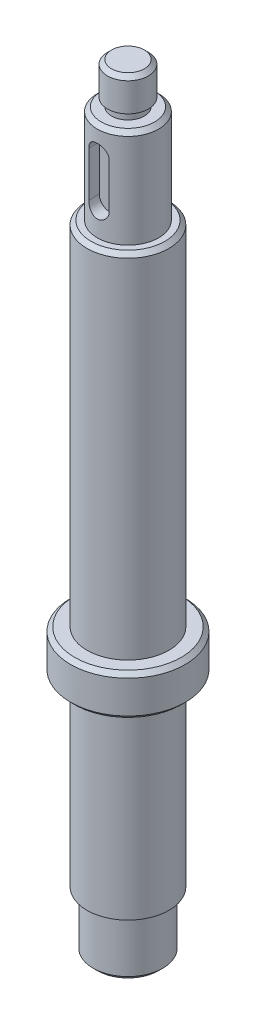
ISO-10303-21;
HEADER;
FILE_DESCRIPTION(('STEP AP214'),'2;1');
FILE_NAME('part.step','',(''),(''),'','','');
FILE_SCHEMA(('AUTOMOTIVE_DESIGN { 1 0 10303 214 1 1 1 1 }'));
ENDSEC;
DATA;
#1=APPLICATION_CONTEXT('core data for automotive mechanical design processes');
#2=APPLICATION_PROTOCOL_DEFINITION('international standard','automotive_design',2000,#1);
#3=PRODUCT_CONTEXT('',#1,'mechanical');
#4=PRODUCT('Part','Part','',(#3));
#5=PRODUCT_RELATED_PRODUCT_CATEGORY('part','',(#4));
#6=PRODUCT_DEFINITION_FORMATION('','',#4);
#7=PRODUCT_DEFINITION_CONTEXT('part definition',#1,'design');
#8=PRODUCT_DEFINITION('design','',#6,#7);
#9=PRODUCT_DEFINITION_SHAPE('','',#8);
#10=(LENGTH_UNIT() NAMED_UNIT(*) SI_UNIT(.MILLI.,.METRE.));
#11=(NAMED_UNIT(*) PLANE_ANGLE_UNIT() SI_UNIT($,.RADIAN.));
#12=(NAMED_UNIT(*) SI_UNIT($,.STERADIAN.) SOLID_ANGLE_UNIT());
#13=UNCERTAINTY_MEASURE_WITH_UNIT(LENGTH_MEASURE(1.E-05),#10,'distance_accuracy_value','');
#14=(GEOMETRIC_REPRESENTATION_CONTEXT(3) GLOBAL_UNCERTAINTY_ASSIGNED_CONTEXT((#13)) GLOBAL_UNIT_ASSIGNED_CONTEXT((#10,
#11,#12)) REPRESENTATION_CONTEXT('',''));
#15=CARTESIAN_POINT('',(0.,0.,0.));
#16=DIRECTION('',(0.,0.,1.));
#17=DIRECTION('',(1.,0.,0.));
#18=AXIS2_PLACEMENT_3D('',#15,#16,#17);
#19=CARTESIAN_POINT('',(0.,0.,0.));
#20=DIRECTION('',(0.,1.,0.));
#21=DIRECTION('',(0.,0.,1.));
#22=AXIS2_PLACEMENT_3D('',#19,#20,#21);
#23=CYLINDRICAL_SURFACE('',#22,9.99999999999998);
#24=CARTESIAN_POINT('',(0.,-175.,0.));
#25=DIRECTION('',(0.,1.,0.));
#26=DIRECTION('',(0.,0.,1.));
#27=AXIS2_PLACEMENT_3D('',#24,#25,#26);
#28=CIRCLE('',#27,9.99999999999998);
#29=CARTESIAN_POINT('',(0.,-175.,9.99999999999998));
#30=VERTEX_POINT('',#29);
#31=EDGE_CURVE('E175',#30,#30,#28,.T.);
#32=ORIENTED_EDGE('',*,*,#31,.T.);
#33=EDGE_LOOP('',(#32));
#34=FACE_BOUND('',#33,.T.);
#35=CARTESIAN_POINT('',(0.,-130.,0.));
#36=DIRECTION('',(0.,1.,0.));
#37=DIRECTION('',(0.,0.,1.));
#38=AXIS2_PLACEMENT_3D('',#35,#36,#37);
#39=CIRCLE('',#38,9.99999999999999);
#40=CARTESIAN_POINT('',(0.,-130.,9.99999999999999));
#41=VERTEX_POINT('',#40);
#42=EDGE_CURVE('E179',#41,#41,#39,.T.);
#43=ORIENTED_EDGE('',*,*,#42,.F.);
#44=EDGE_LOOP('',(#43));
#45=FACE_BOUND('',#44,.T.);
#46=DIRECTION('',(0.,1.,0.));
#47=VECTOR('',#46,1.);
#48=CARTESIAN_POINT('',(3.,0.,-9.53939201416944));
#49=LINE('',#48,#47);
#50=CARTESIAN_POINT('',(3.,-152.,-9.53939201416944));
#51=VERTEX_POINT('',#50);
#52=CARTESIAN_POINT('',(3.,-138.,-9.53939201416944));
#53=VERTEX_POINT('',#52);
#54=EDGE_CURVE('E11',#51,#53,#49,.T.);
#55=ORIENTED_EDGE('',*,*,#54,.T.);
#56=CARTESIAN_POINT('',(3.,-138.,-9.53939201416944));
#57=CARTESIAN_POINT('',(3.00001027845728,-137.917664479177,-9.53938054248205));
#58=CARTESIAN_POINT('',(2.99661062684472,-137.835335544937,-9.54045772064377));
#59=CARTESIAN_POINT('',(2.98307142899347,-137.671306047235,-9.54470412105984));
#60=CARTESIAN_POINT('',(2.97293339805419,-137.589605346676,-9.54787287296847));
#61=CARTESIAN_POINT('',(2.94603140625046,-137.427615084327,-9.55620668351001));
#62=CARTESIAN_POINT('',(2.92928426957737,-137.347322475957,-9.56136667250113));
#63=CARTESIAN_POINT('',(2.88932853030395,-137.188524155866,-9.57351626651177));
#64=CARTESIAN_POINT('',(2.86611975872641,-137.110018490933,-9.58050591937826));
#65=CARTESIAN_POINT('',(2.78708584446024,-136.87805061201,-9.60391637654135));
#66=CARTESIAN_POINT('',(2.72181852542972,-136.727931561167,-9.62279007830389));
#67=CARTESIAN_POINT('',(2.56815043531276,-136.440773956021,-9.66493213967818));
#68=CARTESIAN_POINT('',(2.4797388992416,-136.303741529238,-9.68820254290639));
#69=CARTESIAN_POINT('',(2.27929879634443,-136.042277012052,-9.73733650515373));
#70=CARTESIAN_POINT('',(2.16666914746584,-135.918315125939,-9.76325505469872));
#71=CARTESIAN_POINT('',(1.92227736150434,-135.690726385161,-9.81429628475076));
#72=CARTESIAN_POINT('',(1.79051199848164,-135.587102966139,-9.83941883019408));
#73=CARTESIAN_POINT('',(1.50821997465698,-135.401073134905,-9.88666477976533));
#74=CARTESIAN_POINT('',(1.35736167401016,-135.319149820217,-9.90871541546876));
#75=CARTESIAN_POINT('',(1.04324233568303,-135.182022995997,-9.94668940088142));
#76=CARTESIAN_POINT('',(0.879984508687989,-135.126812596632,-9.96261433032401));
#77=CARTESIAN_POINT('',(0.550649404820608,-135.046240448209,-9.98615279768396));
#78=CARTESIAN_POINT('',(0.384786253016209,-135.020070296482,-9.9939909852679));
#79=CARTESIAN_POINT('',(0.0508471415689364,-134.995765304854,-10.0012640407204));
#80=CARTESIAN_POINT('',(-0.117228393125328,-134.997625157322,-10.0007004995012));
#81=CARTESIAN_POINT('',(-0.445143199271813,-135.028785820691,-9.99139205125585));
#82=CARTESIAN_POINT('',(-0.605074290763018,-135.057210690808,-9.98290831016511));
#83=CARTESIAN_POINT('',(-0.917780104370304,-135.139263269625,-9.95903027401821));
#84=CARTESIAN_POINT('',(-1.07055445110878,-135.192892298683,-9.94363561692557));
#85=CARTESIAN_POINT('',(-1.3666956317391,-135.324424443525,-9.9073042985178));
#86=CARTESIAN_POINT('',(-1.50993201207611,-135.402603288776,-9.88630511384913));
#87=CARTESIAN_POINT('',(-1.78153105916099,-135.580797180034,-9.84099249303645));
#88=CARTESIAN_POINT('',(-1.90989038323249,-135.680817118941,-9.81667831471804));
#89=CARTESIAN_POINT('',(-2.15330901082204,-135.904383976185,-9.76623347142779));
#90=CARTESIAN_POINT('',(-2.26766702955975,-136.028687727526,-9.74006890899095));
#91=CARTESIAN_POINT('',(-2.47413538985067,-136.294994846851,-9.68968430229325));
#92=CARTESIAN_POINT('',(-2.5662392402618,-136.43700336073,-9.66546482675132));
#93=CARTESIAN_POINT('',(-2.72632814481702,-136.7365618569,-9.62154457591301));
#94=CARTESIAN_POINT('',(-2.79406012682263,-136.894254359187,-9.60189192491893));
#95=CARTESIAN_POINT('',(-2.90171772009405,-137.219449007963,-9.56991327306401));
#96=CARTESIAN_POINT('',(-2.94168586436072,-137.386935721429,-9.55757606951748));
#97=CARTESIAN_POINT('',(-2.97802407180158,-137.62998977814,-9.5462806465001));
#98=CARTESIAN_POINT('',(-2.98626405978017,-137.703781468359,-9.54370312550532));
#99=CARTESIAN_POINT('',(-2.99724711229708,-137.851702958199,-9.54025857223562));
#100=CARTESIAN_POINT('',(-2.99999825936538,-137.925832099328,-9.53938902493286));
#101=CARTESIAN_POINT('',(-3.,-138.,-9.53939201416944));
#102=B_SPLINE_CURVE_WITH_KNOTS('',3,(#56,#57,#58,#59,#60,#61,#62,#63,#64,#65,#66,#67,#68,#69,
#70,#71,#72,#73,#74,#75,#76,#77,#78,#79,#80,#81,#82,#83,#84,#85,#86,#87,#88,#89,#90,#91,#92,#93,
#94,#95,#96,#97,#98,#99,#100,#101),.UNSPECIFIED.,.F.,.F.,(4,2,2,2,2,2,2,2,2,2,2,2,2,2,2,2,2,2,2,
2,2,2,4),(0.,0.246918142439474,0.493780777706052,0.740019009623012,0.986263681482012,
1.47813347402026,1.97023245590778,2.47635119822767,2.98255536239032,3.4992281062007,
4.01576751791672,4.51753600864763,5.019209488041,5.50490358251091,5.9906231236083,
6.48200583350619,6.97349873739168,7.48389234847122,7.99443465298716,8.51013494368215,
9.02504345105572,9.24774267716777,9.47011372732391),.UNSPECIFIED.);
#103=CARTESIAN_POINT('',(-3.,-138.,-9.53939201416944));
#104=VERTEX_POINT('',#103);
#105=EDGE_CURVE('E295',#53,#104,#102,.T.);
#106=ORIENTED_EDGE('',*,*,#105,.T.);
#107=DIRECTION('',(0.,1.,0.));
#108=VECTOR('',#107,1.);
#109=CARTESIAN_POINT('',(-3.,0.,-9.53939201416944));
#110=LINE('',#109,#108);
#111=CARTESIAN_POINT('',(-3.,-152.,-9.53939201416944));
#112=VERTEX_POINT('',#111);
#113=EDGE_CURVE('E55',#104,#112,#110,.F.);
#114=ORIENTED_EDGE('',*,*,#113,.T.);
#115=CARTESIAN_POINT('',(-3.,-152.,-9.53939201416944));
#116=CARTESIAN_POINT('',(-3.00001027845728,-152.082335520823,-9.53938054248205));
#117=CARTESIAN_POINT('',(-2.99661062684472,-152.164664455063,-9.54045772064377));
#118=CARTESIAN_POINT('',(-2.98307142899347,-152.328693952765,-9.54470412105984));
#119=CARTESIAN_POINT('',(-2.97293339805418,-152.410394653324,-9.54787287296847));
#120=CARTESIAN_POINT('',(-2.94603140625045,-152.572384915673,-9.55620668351001));
#121=CARTESIAN_POINT('',(-2.92928426957737,-152.652677524043,-9.56136667250113));
#122=CARTESIAN_POINT('',(-2.88932853030395,-152.811475844134,-9.57351626651177));
#123=CARTESIAN_POINT('',(-2.86611975872641,-152.889981509067,-9.58050591937826));
#124=CARTESIAN_POINT('',(-2.78708584446024,-153.12194938799,-9.60391637654135));
#125=CARTESIAN_POINT('',(-2.72181852542972,-153.272068438833,-9.62279007830389));
#126=CARTESIAN_POINT('',(-2.56815043531276,-153.559226043979,-9.66493213967818));
#127=CARTESIAN_POINT('',(-2.4797388992416,-153.696258470762,-9.68820254290639));
#128=CARTESIAN_POINT('',(-2.27929879634443,-153.957722987948,-9.73733650515373));
#129=CARTESIAN_POINT('',(-2.16666914746584,-154.081684874061,-9.76325505469872));
#130=CARTESIAN_POINT('',(-1.92227736150434,-154.309273614839,-9.81429628475075));
#131=CARTESIAN_POINT('',(-1.79051199848164,-154.412897033861,-9.83941883019408));
#132=CARTESIAN_POINT('',(-1.50821997465698,-154.598926865095,-9.88666477976533));
#133=CARTESIAN_POINT('',(-1.35736167401016,-154.680850179783,-9.90871541546876));
#134=CARTESIAN_POINT('',(-1.04324233568303,-154.817977004003,-9.94668940088142));
#135=CARTESIAN_POINT('',(-0.879984508687989,-154.873187403368,-9.96261433032401));
#136=CARTESIAN_POINT('',(-0.550649404820608,-154.953759551791,-9.98615279768396));
#137=CARTESIAN_POINT('',(-0.384786253016209,-154.979929703518,-9.9939909852679));
#138=CARTESIAN_POINT('',(-0.0508471415689364,-155.004234695146,-10.0012640407204));
#139=CARTESIAN_POINT('',(0.117228393125328,-155.002374842678,-10.0007004995012));
#140=CARTESIAN_POINT('',(0.445143199271813,-154.971214179309,-9.99139205125585));
#141=CARTESIAN_POINT('',(0.605074290763018,-154.942789309192,-9.98290831016511));
#142=CARTESIAN_POINT('',(0.917780104370304,-154.860736730375,-9.95903027401821));
#143=CARTESIAN_POINT('',(1.07055445110878,-154.807107701317,-9.94363561692557));
#144=CARTESIAN_POINT('',(1.3666956317391,-154.675575556475,-9.9073042985178));
#145=CARTESIAN_POINT('',(1.50993201207611,-154.597396711224,-9.88630511384913));
#146=CARTESIAN_POINT('',(1.78153105916099,-154.419202819966,-9.84099249303645));
#147=CARTESIAN_POINT('',(1.90989038323249,-154.319182881059,-9.81667831471804));
#148=CARTESIAN_POINT('',(2.15330901082204,-154.095616023815,-9.76623347142779));
#149=CARTESIAN_POINT('',(2.26766702955975,-153.971312272474,-9.74006890899095));
#150=CARTESIAN_POINT('',(2.47413538985067,-153.705005153149,-9.68968430229325));
#151=CARTESIAN_POINT('',(2.5662392402618,-153.56299663927,-9.66546482675132));
#152=CARTESIAN_POINT('',(2.72632814481701,-153.2634381431,-9.62154457591302));
#153=CARTESIAN_POINT('',(2.79406012682262,-153.105745640813,-9.60189192491894));
#154=CARTESIAN_POINT('',(2.90171772009404,-152.780550992037,-9.56991327306401));
#155=CARTESIAN_POINT('',(2.94168586436072,-152.613064278571,-9.55757606951748));
#156=CARTESIAN_POINT('',(2.97802407180158,-152.37001022186,-9.5462806465001));
#157=CARTESIAN_POINT('',(2.98626405978017,-152.296218531641,-9.54370312550532));
#158=CARTESIAN_POINT('',(2.99724711229708,-152.148297041801,-9.54025857223563));
#159=CARTESIAN_POINT('',(2.99999825936538,-152.074167900672,-9.53938902493286));
#160=CARTESIAN_POINT('',(3.,-152.,-9.53939201416944));
#161=B_SPLINE_CURVE_WITH_KNOTS('',3,(#115,#116,#117,#118,#119,#120,#121,#122,#123,#124,#125,
#126,#127,#128,#129,#130,#131,#132,#133,#134,#135,#136,#137,#138,#139,#140,#141,#142,#143,#144,
#145,#146,#147,#148,#149,#150,#151,#152,#153,#154,#155,#156,#157,#158,#159,#160),.UNSPECIFIED.,
.F.,.F.,(4,2,2,2,2,2,2,2,2,2,2,2,2,2,2,2,2,2,2,2,2,2,4),(0.,0.246918142439474,0.49378077770608,
0.740019009623012,0.986263681482012,1.47813347402026,1.97023245590778,2.47635119822767,
2.98255536239032,3.4992281062007,4.01576751791672,4.51753600864763,5.019209488041,
5.50490358251091,5.9906231236083,6.48200583350619,6.97349873739168,7.48389234847122,
7.99443465298716,8.51013494368209,9.02504345105573,9.24774267716778,9.47011372732391),.UNSPECIFIED.);
#162=EDGE_CURVE('E62',#112,#51,#161,.T.);
#163=ORIENTED_EDGE('',*,*,#162,.T.);
#164=EDGE_LOOP('',(#55,#106,#114,#163));
#165=FACE_BOUND('',#164,.T.);
#166=ADVANCED_FACE('F45',(#34,#45,#165),#23,.T.);
#167=CARTESIAN_POINT('',(0.,0.,0.));
#168=DIRECTION('',(0.,1.,0.));
#169=DIRECTION('',(0.,0.,1.));
#170=AXIS2_PLACEMENT_3D('',#167,#168,#169);
#171=PLANE('',#170);
#172=CARTESIAN_POINT('',(0.,0.,0.));
#173=DIRECTION('',(0.,1.,0.));
#174=DIRECTION('',(0.,0.,1.));
#175=AXIS2_PLACEMENT_3D('',#172,#173,#174);
#176=CIRCLE('',#175,4.);
#177=CARTESIAN_POINT('',(0.,0.,4.));
#178=VERTEX_POINT('',#177);
#179=EDGE_CURVE('E243',#178,#178,#176,.T.);
#180=ORIENTED_EDGE('',*,*,#179,.T.);
#181=EDGE_LOOP('',(#180));
#182=FACE_BOUND('',#181,.T.);
#183=ADVANCED_FACE('F329',(#182),#171,.T.);
#184=CARTESIAN_POINT('',(0.,0.,0.));
#185=DIRECTION('',(0.,1.,0.));
#186=DIRECTION('',(0.,0.,1.));
#187=AXIS2_PLACEMENT_3D('',#184,#185,#186);
#188=CYLINDRICAL_SURFACE('',#187,5.);
#189=CARTESIAN_POINT('',(0.,-0.999999999999986,0.));
#190=DIRECTION('',(0.,1.,0.));
#191=DIRECTION('',(0.,0.,1.));
#192=AXIS2_PLACEMENT_3D('',#189,#190,#191);
#193=CIRCLE('',#192,5.);
#194=CARTESIAN_POINT('',(0.,-0.999999999999986,5.));
#195=VERTEX_POINT('',#194);
#196=EDGE_CURVE('E247',#195,#195,#193,.F.);
#197=ORIENTED_EDGE('',*,*,#196,.T.);
#198=EDGE_LOOP('',(#197));
#199=FACE_BOUND('',#198,.T.);
#200=CARTESIAN_POINT('',(0.,-8.,0.));
#201=DIRECTION('',(0.,1.,0.));
#202=DIRECTION('',(0.,0.,1.));
#203=AXIS2_PLACEMENT_3D('',#200,#201,#202);
#204=CIRCLE('',#203,5.);
#205=CARTESIAN_POINT('',(0.,-8.,5.));
#206=VERTEX_POINT('',#205);
#207=EDGE_CURVE('E199',#206,#206,#204,.T.);
#208=ORIENTED_EDGE('',*,*,#207,.T.);
#209=EDGE_LOOP('',(#208));
#210=FACE_BOUND('',#209,.T.);
#211=ADVANCED_FACE('F334',(#199,#210),#188,.T.);
#212=CARTESIAN_POINT('',(-5.,-8.,0.));
#213=DIRECTION('',(0.,-1.,0.));
#214=DIRECTION('',(0.,0.,-1.));
#215=AXIS2_PLACEMENT_3D('',#212,#213,#214);
#216=PLANE('',#215);
#217=CARTESIAN_POINT('',(0.,-8.,0.));
#218=DIRECTION('',(0.,1.,0.));
#219=DIRECTION('',(0.,0.,1.));
#220=AXIS2_PLACEMENT_3D('',#217,#218,#219);
#221=CIRCLE('',#220,4.);
#222=CARTESIAN_POINT('',(0.,-8.,4.));
#223=VERTEX_POINT('',#222);
#224=EDGE_CURVE('E195',#223,#223,#221,.T.);
#225=ORIENTED_EDGE('',*,*,#224,.T.);
#226=EDGE_LOOP('',(#225));
#227=FACE_BOUND('',#226,.T.);
#228=ORIENTED_EDGE('',*,*,#207,.F.);
#229=EDGE_LOOP('',(#228));
#230=FACE_BOUND('',#229,.T.);
#231=ADVANCED_FACE('F440',(#227,#230),#216,.T.);
#232=CARTESIAN_POINT('',(0.,0.,0.));
#233=DIRECTION('',(0.,1.,0.));
#234=DIRECTION('',(0.,0.,1.));
#235=AXIS2_PLACEMENT_3D('',#232,#233,#234);
#236=CYLINDRICAL_SURFACE('',#235,4.);
#237=CARTESIAN_POINT('',(0.,-10.,0.));
#238=DIRECTION('',(0.,1.,0.));
#239=DIRECTION('',(0.,0.,1.));
#240=AXIS2_PLACEMENT_3D('',#237,#238,#239);
#241=CIRCLE('',#240,4.);
#242=CARTESIAN_POINT('',(0.,-10.,4.));
#243=VERTEX_POINT('',#242);
#244=EDGE_CURVE('E191',#243,#243,#241,.T.);
#245=ORIENTED_EDGE('',*,*,#244,.T.);
#246=EDGE_LOOP('',(#245));
#247=FACE_BOUND('',#246,.T.);
#248=ORIENTED_EDGE('',*,*,#224,.F.);
#249=EDGE_LOOP('',(#248));
#250=FACE_BOUND('',#249,.T.);
#251=ADVANCED_FACE('F435',(#247,#250),#236,.T.);
#252=CARTESIAN_POINT('',(-4.,-10.,0.));
#253=DIRECTION('',(0.,1.,0.));
#254=DIRECTION('',(0.,0.,1.));
#255=AXIS2_PLACEMENT_3D('',#252,#253,#254);
#256=PLANE('',#255);
#257=CARTESIAN_POINT('',(0.,-10.,0.));
#258=DIRECTION('',(0.,1.,0.));
#259=DIRECTION('',(0.,0.,1.));
#260=AXIS2_PLACEMENT_3D('',#257,#258,#259);
#261=CIRCLE('',#260,6.50000000000001);
#262=CARTESIAN_POINT('',(0.,-10.,6.50000000000001));
#263=VERTEX_POINT('',#262);
#264=EDGE_CURVE('E235',#263,#263,#261,.T.);
#265=ORIENTED_EDGE('',*,*,#264,.T.);
#266=EDGE_LOOP('',(#265));
#267=FACE_BOUND('',#266,.T.);
#268=ORIENTED_EDGE('',*,*,#244,.F.);
#269=EDGE_LOOP('',(#268));
#270=FACE_BOUND('',#269,.T.);
#271=ADVANCED_FACE('F356',(#267,#270),#256,.T.);
#272=CARTESIAN_POINT('',(0.,0.,0.));
#273=DIRECTION('',(0.,1.,0.));
#274=DIRECTION('',(0.,0.,1.));
#275=AXIS2_PLACEMENT_3D('',#272,#273,#274);
#276=CYLINDRICAL_SURFACE('',#275,7.5);
#277=CARTESIAN_POINT('',(-2.5,-27.5,7.07106781186548));
#278=CARTESIAN_POINT('',(-2.50000899110405,-27.5682070778203,7.07105693273157));
#279=CARTESIAN_POINT('',(-2.49720887221585,-27.6364080746754,7.07205443904569));
#280=CARTESIAN_POINT('',(-2.4860604578047,-27.7722810383493,7.07598524121007));
#281=CARTESIAN_POINT('',(-2.47771365997202,-27.8399531429881,7.07891801450643));
#282=CARTESIAN_POINT('',(-2.45557459422795,-27.9740904883546,7.08662705252507));
#283=CARTESIAN_POINT('',(-2.44179847763135,-28.0405587025509,7.09139784850118));
#284=CARTESIAN_POINT('',(-2.4089418103012,-28.1720082685828,7.10262619906002));
#285=CARTESIAN_POINT('',(-2.38986106786032,-28.2369895665899,7.10908381460331));
#286=CARTESIAN_POINT('',(-2.32491551306196,-28.4289615797146,7.13069940793912));
#287=CARTESIAN_POINT('',(-2.2713141681025,-28.55317915747,7.14811243884051));
#288=CARTESIAN_POINT('',(-2.14517784106254,-28.7908768114634,7.1869703408752));
#289=CARTESIAN_POINT('',(-2.07263123268531,-28.9043502357802,7.20841768551077));
#290=CARTESIAN_POINT('',(-1.90762995846818,-29.1217929034708,7.25386182389479));
#291=CARTESIAN_POINT('',(-1.81456284630833,-29.2252851427682,7.27792189428067));
#292=CARTESIAN_POINT('',(-1.61247071190512,-29.4155171032337,7.32534626726038));
#293=CARTESIAN_POINT('',(-1.50344285413658,-29.502253841319,7.34871044533518));
#294=CARTESIAN_POINT('',(-1.26900922493972,-29.6586982242625,7.39284706096344));
#295=CARTESIAN_POINT('',(-1.14325025284461,-29.7279023077422,7.41353593532888));
#296=CARTESIAN_POINT('',(-0.881073095475287,-29.8439807824347,7.44924021883279));
#297=CARTESIAN_POINT('',(-0.744658181225882,-29.8908619949257,7.46425736081204));
#298=CARTESIAN_POINT('',(-0.470073371182908,-29.9593392762583,7.48647677762783));
#299=CARTESIAN_POINT('',(-0.332129588153743,-29.9817581709572,7.49393272446142));
#300=CARTESIAN_POINT('',(-0.0542474216361983,-30.0032907567385,7.50109021034827));
#301=CARTESIAN_POINT('',(0.0856904786402179,-30.0024100009158,7.50079359709905));
#302=CARTESIAN_POINT('',(0.357759612692407,-29.9778892895995,7.49265096581776));
#303=CARTESIAN_POINT('',(0.489981756428176,-29.9551434043953,7.48510152476447));
#304=CARTESIAN_POINT('',(0.748610161077315,-29.8890170040208,7.46367401253772));
#305=CARTESIAN_POINT('',(0.87501609907774,-29.8456353446747,7.44979559044789));
#306=CARTESIAN_POINT('',(1.12038155754035,-29.7389465758056,7.41689170677793));
#307=CARTESIAN_POINT('',(1.23922126412503,-29.6753848871424,7.39780094595656));
#308=CARTESIAN_POINT('',(1.46481147275367,-29.530350121575,7.35645969200236));
#309=CARTESIAN_POINT('',(1.57155867428944,-29.4488721723979,7.33420833994017));
#310=CARTESIAN_POINT('',(1.77524334927518,-29.2658223749931,7.28765679856813));
#311=CARTESIAN_POINT('',(1.87148402903099,-29.1634861409718,7.26330946699776));
#312=CARTESIAN_POINT('',(2.04568006205173,-28.9438962757136,7.21618726182137));
#313=CARTESIAN_POINT('',(2.12362950795974,-28.826637843993,7.19341289789386));
#314=CARTESIAN_POINT('',(2.26000831398175,-28.5782995541157,7.15175078440791));
#315=CARTESIAN_POINT('',(2.31813252376915,-28.4470412126674,7.13292537370586));
#316=CARTESIAN_POINT('',(2.41115057675285,-28.1758825560254,7.10202742655098));
#317=CARTESIAN_POINT('',(2.4460810901384,-28.0359962665697,7.08994423522482));
#318=CARTESIAN_POINT('',(2.47914539070207,-27.82895340813,7.078413552368));
#319=CARTESIAN_POINT('',(2.48696265313779,-27.7633965253644,7.07566669236505));
#320=CARTESIAN_POINT('',(2.497386540178,-27.6319048040005,7.07199258928497));
#321=CARTESIAN_POINT('',(2.49999988848745,-27.565970563639,7.0710629982382));
#322=CARTESIAN_POINT('',(2.5,-27.5,7.07106781186548));
#323=B_SPLINE_CURVE_WITH_KNOTS('',3,(#277,#278,#279,#280,#281,#282,#283,#284,#285,#286,#287,
#288,#289,#290,#291,#292,#293,#294,#295,#296,#297,#298,#299,#300,#301,#302,#303,#304,#305,#306,
#307,#308,#309,#310,#311,#312,#313,#314,#315,#316,#317,#318,#319,#320,#321,#322),.UNSPECIFIED.,
.F.,.F.,(4,2,2,2,2,2,2,2,2,2,2,2,2,2,2,2,2,2,2,2,2,2,4),(0.,0.204546211838584,0.409037215423656,
0.612924429429078,0.816819012805388,1.22401016923255,1.63145179965523,2.05327864088389,
2.47518051341064,2.90809434014449,3.34087579484513,3.75860278500202,4.17623021758301,
4.57747647846033,4.97874498952315,5.38529148746615,5.79194868153617,6.21771736826821,
6.64362337304801,7.07581676501795,7.50732520398793,7.70536340013574,7.90314555504337),.UNSPECIFIED.);
#324=CARTESIAN_POINT('',(-2.5,-27.5,7.07106781186547));
#325=VERTEX_POINT('',#324);
#326=CARTESIAN_POINT('',(2.5,-27.5,7.07106781186548));
#327=VERTEX_POINT('',#326);
#328=EDGE_CURVE('E251',#325,#327,#323,.T.);
#329=ORIENTED_EDGE('',*,*,#328,.F.);
#330=DIRECTION('',(0.,1.,0.));
#331=VECTOR('',#330,1.);
#332=CARTESIAN_POINT('',(-2.5,0.,7.07106781186547));
#333=LINE('',#332,#331);
#334=CARTESIAN_POINT('',(-2.5,-16.5,7.07106781186548));
#335=VERTEX_POINT('',#334);
#336=EDGE_CURVE('E292',#335,#325,#333,.F.);
#337=ORIENTED_EDGE('',*,*,#336,.F.);
#338=CARTESIAN_POINT('',(2.5,-16.5,7.07106781186548));
#339=CARTESIAN_POINT('',(2.50000899110406,-16.4317929221797,7.07105693273157));
#340=CARTESIAN_POINT('',(2.49720887221585,-16.3635919253246,7.07205443904569));
#341=CARTESIAN_POINT('',(2.4860604578047,-16.2277189616507,7.07598524121008));
#342=CARTESIAN_POINT('',(2.47771365997202,-16.160046857012,7.07891801450643));
#343=CARTESIAN_POINT('',(2.45557459422795,-16.0259095116455,7.08662705252507));
#344=CARTESIAN_POINT('',(2.44179847763135,-15.9594412974491,7.09139784850119));
#345=CARTESIAN_POINT('',(2.4089418103012,-15.8279917314172,7.10262619906002));
#346=CARTESIAN_POINT('',(2.38986106786032,-15.7630104334101,7.10908381460331));
#347=CARTESIAN_POINT('',(2.32491551306195,-15.5710384202854,7.13069940793912));
#348=CARTESIAN_POINT('',(2.2713141681025,-15.44682084253,7.14811243884051));
#349=CARTESIAN_POINT('',(2.14517784106254,-15.2091231885366,7.1869703408752));
#350=CARTESIAN_POINT('',(2.07263123268531,-15.0956497642198,7.20841768551077));
#351=CARTESIAN_POINT('',(1.90762995846818,-14.8782070965292,7.25386182389479));
#352=CARTESIAN_POINT('',(1.81456284630832,-14.7747148572318,7.27792189428067));
#353=CARTESIAN_POINT('',(1.61247071190512,-14.5844828967663,7.32534626726038));
#354=CARTESIAN_POINT('',(1.50344285413657,-14.497746158681,7.34871044533518));
#355=CARTESIAN_POINT('',(1.26900922493971,-14.3413017757375,7.39284706096344));
#356=CARTESIAN_POINT('',(1.1432502528446,-14.2720976922578,7.41353593532888));
#357=CARTESIAN_POINT('',(0.881073095475283,-14.1560192175653,7.44924021883279));
#358=CARTESIAN_POINT('',(0.744658181225878,-14.1091380050743,7.46425736081204));
#359=CARTESIAN_POINT('',(0.470073371182903,-14.0406607237417,7.48647677762783));
#360=CARTESIAN_POINT('',(0.332129588153738,-14.0182418290428,7.49393272446142));
#361=CARTESIAN_POINT('',(0.0542474216361945,-13.9967092432615,7.50109021034827));
#362=CARTESIAN_POINT('',(-0.0856904786402211,-13.9975899990842,7.50079359709905));
#363=CARTESIAN_POINT('',(-0.357759612692409,-14.0221107104005,7.49265096581776));
#364=CARTESIAN_POINT('',(-0.489981756428178,-14.0448565956047,7.48510152476446));
#365=CARTESIAN_POINT('',(-0.748610161077317,-14.1109829959792,7.46367401253772));
#366=CARTESIAN_POINT('',(-0.875016099077742,-14.1543646553253,7.44979559044789));
#367=CARTESIAN_POINT('',(-1.12038155754035,-14.2610534241945,7.41689170677793));
#368=CARTESIAN_POINT('',(-1.23922126412504,-14.3246151128576,7.39780094595656));
#369=CARTESIAN_POINT('',(-1.46481147275367,-14.469649878425,7.35645969200235));
#370=CARTESIAN_POINT('',(-1.57155867428944,-14.5511278276021,7.33420833994017));
#371=CARTESIAN_POINT('',(-1.77524334927518,-14.734177625007,7.28765679856813));
#372=CARTESIAN_POINT('',(-1.87148402903099,-14.8365138590283,7.26330946699776));
#373=CARTESIAN_POINT('',(-2.04568006205173,-15.0561037242864,7.21618726182137));
#374=CARTESIAN_POINT('',(-2.12362950795974,-15.173362156007,7.19341289789385));
#375=CARTESIAN_POINT('',(-2.26000831398175,-15.4217004458843,7.15175078440791));
#376=CARTESIAN_POINT('',(-2.31813252376915,-15.5529587873326,7.13292537370586));
#377=CARTESIAN_POINT('',(-2.41115057675285,-15.8241174439746,7.10202742655098));
#378=CARTESIAN_POINT('',(-2.4460810901384,-15.9640037334303,7.08994423522482));
#379=CARTESIAN_POINT('',(-2.47914539070207,-16.17104659187,7.078413552368));
#380=CARTESIAN_POINT('',(-2.48696265313779,-16.2366034746356,7.07566669236505));
#381=CARTESIAN_POINT('',(-2.49738654017799,-16.3680951959995,7.07199258928497));
#382=CARTESIAN_POINT('',(-2.49999988848745,-16.434029436361,7.0710629982382));
#383=CARTESIAN_POINT('',(-2.5,-16.5,7.07106781186547));
#384=B_SPLINE_CURVE_WITH_KNOTS('',3,(#338,#339,#340,#341,#342,#343,#344,#345,#346,#347,#348,
#349,#350,#351,#352,#353,#354,#355,#356,#357,#358,#359,#360,#361,#362,#363,#364,#365,#366,#367,
#368,#369,#370,#371,#372,#373,#374,#375,#376,#377,#378,#379,#380,#381,#382,#383),.UNSPECIFIED.,
.F.,.F.,(4,2,2,2,2,2,2,2,2,2,2,2,2,2,2,2,2,2,2,2,2,2,4),(0.,0.20454621183858,0.409037215423656,
0.612924429429074,0.816819012805391,1.22401016923255,1.63145179965523,2.0532786408839,
2.47518051341064,2.90809434014449,3.34087579484514,3.75860278500203,4.17623021758302,
4.57747647846034,4.97874498952315,5.38529148746615,5.79194868153617,6.21771736826821,
6.64362337304802,7.07581676501795,7.50732520398793,7.70536340013574,7.90314555504336),.UNSPECIFIED.);
#385=CARTESIAN_POINT('',(2.5,-16.5,7.07106781186548));
#386=VERTEX_POINT('',#385);
#387=EDGE_CURVE('E285',#386,#335,#384,.T.);
#388=ORIENTED_EDGE('',*,*,#387,.F.);
#389=DIRECTION('',(0.,1.,0.));
#390=VECTOR('',#389,1.);
#391=CARTESIAN_POINT('',(2.5,0.,7.07106781186548));
#392=LINE('',#391,#390);
#393=EDGE_CURVE('E260',#327,#386,#392,.T.);
#394=ORIENTED_EDGE('',*,*,#393,.F.);
#395=EDGE_LOOP('',(#329,#337,#388,#394));
#396=FACE_BOUND('',#395,.T.);
#397=CARTESIAN_POINT('',(0.,-11.,0.));
#398=DIRECTION('',(0.,1.,0.));
#399=DIRECTION('',(0.,0.,1.));
#400=AXIS2_PLACEMENT_3D('',#397,#398,#399);
#401=CIRCLE('',#400,7.5);
#402=CARTESIAN_POINT('',(0.,-11.,7.5));
#403=VERTEX_POINT('',#402);
#404=EDGE_CURVE('E239',#403,#403,#401,.F.);
#405=ORIENTED_EDGE('',*,*,#404,.T.);
#406=EDGE_LOOP('',(#405));
#407=FACE_BOUND('',#406,.T.);
#408=CARTESIAN_POINT('',(0.,-34.,0.));
#409=DIRECTION('',(0.,1.,0.));
#410=DIRECTION('',(0.,0.,1.));
#411=AXIS2_PLACEMENT_3D('',#408,#409,#410);
#412=CIRCLE('',#411,7.5);
#413=CARTESIAN_POINT('',(0.,-34.,7.5));
#414=VERTEX_POINT('',#413);
#415=EDGE_CURVE('E187',#414,#414,#412,.T.);
#416=ORIENTED_EDGE('',*,*,#415,.T.);
#417=EDGE_LOOP('',(#416));
#418=FACE_BOUND('',#417,.T.);
#419=ADVANCED_FACE('F262',(#396,#407,#418),#276,.T.);
#420=CARTESIAN_POINT('',(-7.5,-34.,0.));
#421=DIRECTION('',(0.,1.,0.));
#422=DIRECTION('',(0.,0.,1.));
#423=AXIS2_PLACEMENT_3D('',#420,#421,#422);
#424=PLANE('',#423);
#425=CARTESIAN_POINT('',(0.,-34.,0.));
#426=DIRECTION('',(0.,1.,0.));
#427=DIRECTION('',(0.,0.,1.));
#428=AXIS2_PLACEMENT_3D('',#425,#426,#427);
#429=CIRCLE('',#428,8.99999999999998);
#430=CARTESIAN_POINT('',(0.,-34.,8.99999999999998));
#431=VERTEX_POINT('',#430);
#432=EDGE_CURVE('E227',#431,#431,#429,.T.);
#433=ORIENTED_EDGE('',*,*,#432,.T.);
#434=EDGE_LOOP('',(#433));
#435=FACE_BOUND('',#434,.T.);
#436=ORIENTED_EDGE('',*,*,#415,.F.);
#437=EDGE_LOOP('',(#436));
#438=FACE_BOUND('',#437,.T.);
#439=ADVANCED_FACE('F355',(#435,#438),#424,.T.);
#440=CARTESIAN_POINT('',(0.,0.,0.));
#441=DIRECTION('',(0.,1.,0.));
#442=DIRECTION('',(0.,0.,1.));
#443=AXIS2_PLACEMENT_3D('',#440,#441,#442);
#444=CYLINDRICAL_SURFACE('',#443,9.99999999999999);
#445=CARTESIAN_POINT('',(0.,-35.,0.));
#446=DIRECTION('',(0.,1.,0.));
#447=DIRECTION('',(0.,0.,1.));
#448=AXIS2_PLACEMENT_3D('',#445,#446,#447);
#449=CIRCLE('',#448,9.99999999999999);
#450=CARTESIAN_POINT('',(0.,-35.,9.99999999999999));
#451=VERTEX_POINT('',#450);
#452=EDGE_CURVE('E231',#451,#451,#449,.F.);
#453=ORIENTED_EDGE('',*,*,#452,.T.);
#454=EDGE_LOOP('',(#453));
#455=FACE_BOUND('',#454,.T.);
#456=CARTESIAN_POINT('',(0.,-120.,0.));
#457=DIRECTION('',(0.,1.,0.));
#458=DIRECTION('',(0.,0.,1.));
#459=AXIS2_PLACEMENT_3D('',#456,#457,#458);
#460=CIRCLE('',#459,9.99999999999999);
#461=CARTESIAN_POINT('',(0.,-120.,9.99999999999999));
#462=VERTEX_POINT('',#461);
#463=EDGE_CURVE('E183',#462,#462,#460,.T.);
#464=ORIENTED_EDGE('',*,*,#463,.T.);
#465=EDGE_LOOP('',(#464));
#466=FACE_BOUND('',#465,.T.);
#467=ADVANCED_FACE('F362',(#455,#466),#444,.T.);
#468=CARTESIAN_POINT('',(-9.99999999999999,-120.,0.));
#469=DIRECTION('',(0.,1.,0.));
#470=DIRECTION('',(0.,0.,1.));
#471=AXIS2_PLACEMENT_3D('',#468,#469,#470);
#472=PLANE('',#471);
#473=CARTESIAN_POINT('',(0.,-120.,0.));
#474=DIRECTION('',(0.,1.,0.));
#475=DIRECTION('',(0.,0.,1.));
#476=AXIS2_PLACEMENT_3D('',#473,#474,#475);
#477=CIRCLE('',#476,13.);
#478=CARTESIAN_POINT('',(0.,-120.,13.));
#479=VERTEX_POINT('',#478);
#480=EDGE_CURVE('E223',#479,#479,#477,.T.);
#481=ORIENTED_EDGE('',*,*,#480,.T.);
#482=EDGE_LOOP('',(#481));
#483=FACE_BOUND('',#482,.T.);
#484=ORIENTED_EDGE('',*,*,#463,.F.);
#485=EDGE_LOOP('',(#484));
#486=FACE_BOUND('',#485,.T.);
#487=ADVANCED_FACE('F367',(#483,#486),#472,.T.);
#488=CARTESIAN_POINT('',(0.,0.,0.));
#489=DIRECTION('',(0.,1.,0.));
#490=DIRECTION('',(0.,0.,1.));
#491=AXIS2_PLACEMENT_3D('',#488,#489,#490);
#492=CYLINDRICAL_SURFACE('',#491,14.);
#493=CARTESIAN_POINT('',(0.,-129.,0.));
#494=DIRECTION('',(0.,-1.,0.));
#495=DIRECTION('',(0.,0.,-1.));
#496=AXIS2_PLACEMENT_3D('',#493,#494,#495);
#497=CIRCLE('',#496,14.);
#498=CARTESIAN_POINT('',(0.,-129.,-14.));
#499=VERTEX_POINT('',#498);
#500=EDGE_CURVE('E215',#499,#499,#497,.F.);
#501=ORIENTED_EDGE('',*,*,#500,.T.);
#502=EDGE_LOOP('',(#501));
#503=FACE_BOUND('',#502,.T.);
#504=CARTESIAN_POINT('',(0.,-121.,0.));
#505=DIRECTION('',(0.,1.,0.));
#506=DIRECTION('',(0.,0.,1.));
#507=AXIS2_PLACEMENT_3D('',#504,#505,#506);
#508=CIRCLE('',#507,14.);
#509=CARTESIAN_POINT('',(0.,-121.,14.));
#510=VERTEX_POINT('',#509);
#511=EDGE_CURVE('E211',#510,#510,#508,.F.);
#512=ORIENTED_EDGE('',*,*,#511,.T.);
#513=EDGE_LOOP('',(#512));
#514=FACE_BOUND('',#513,.T.);
#515=ADVANCED_FACE('F373',(#503,#514),#492,.T.);
#516=CARTESIAN_POINT('',(-14.,-130.,0.));
#517=DIRECTION('',(0.,-1.,0.));
#518=DIRECTION('',(0.,0.,-1.));
#519=AXIS2_PLACEMENT_3D('',#516,#517,#518);
#520=PLANE('',#519);
#521=CARTESIAN_POINT('',(0.,-130.,0.));
#522=DIRECTION('',(0.,-1.,0.));
#523=DIRECTION('',(0.,0.,-1.));
#524=AXIS2_PLACEMENT_3D('',#521,#522,#523);
#525=CIRCLE('',#524,13.);
#526=CARTESIAN_POINT('',(0.,-130.,-13.));
#527=VERTEX_POINT('',#526);
#528=EDGE_CURVE('E219',#527,#527,#525,.T.);
#529=ORIENTED_EDGE('',*,*,#528,.T.);
#530=EDGE_LOOP('',(#529));
#531=FACE_BOUND('',#530,.T.);
#532=ORIENTED_EDGE('',*,*,#42,.T.);
#533=EDGE_LOOP('',(#532));
#534=FACE_BOUND('',#533,.T.);
#535=ADVANCED_FACE('F376',(#531,#534),#520,.T.);
#536=CARTESIAN_POINT('',(-9.99999999999998,-175.,0.));
#537=DIRECTION('',(0.,-1.,0.));
#538=DIRECTION('',(0.,0.,-1.));
#539=AXIS2_PLACEMENT_3D('',#536,#537,#538);
#540=PLANE('',#539);
#541=CARTESIAN_POINT('',(0.,-175.,0.));
#542=DIRECTION('',(0.,1.,0.));
#543=DIRECTION('',(0.,0.,1.));
#544=AXIS2_PLACEMENT_3D('',#541,#542,#543);
#545=CIRCLE('',#544,8.49999999999998);
#546=CARTESIAN_POINT('',(0.,-175.,8.49999999999998));
#547=VERTEX_POINT('',#546);
#548=EDGE_CURVE('E161',#547,#547,#545,.T.);
#549=ORIENTED_EDGE('',*,*,#548,.T.);
#550=EDGE_LOOP('',(#549));
#551=FACE_BOUND('',#550,.T.);
#552=ORIENTED_EDGE('',*,*,#31,.F.);
#553=EDGE_LOOP('',(#552));
#554=FACE_BOUND('',#553,.T.);
#555=ADVANCED_FACE('F379',(#551,#554),#540,.T.);
#556=CARTESIAN_POINT('',(0.,0.,0.));
#557=DIRECTION('',(0.,1.,0.));
#558=DIRECTION('',(0.,0.,1.));
#559=AXIS2_PLACEMENT_3D('',#556,#557,#558);
#560=CYLINDRICAL_SURFACE('',#559,8.49999999999998);
#561=CARTESIAN_POINT('',(0.,-188.,0.));
#562=DIRECTION('',(0.,-1.,0.));
#563=DIRECTION('',(0.,0.,-1.));
#564=AXIS2_PLACEMENT_3D('',#561,#562,#563);
#565=CIRCLE('',#564,8.49999999999998);
#566=CARTESIAN_POINT('',(0.,-188.,-8.49999999999998));
#567=VERTEX_POINT('',#566);
#568=EDGE_CURVE('E203',#567,#567,#565,.F.);
#569=ORIENTED_EDGE('',*,*,#568,.T.);
#570=EDGE_LOOP('',(#569));
#571=FACE_BOUND('',#570,.T.);
#572=ORIENTED_EDGE('',*,*,#548,.F.);
#573=EDGE_LOOP('',(#572));
#574=FACE_BOUND('',#573,.T.);
#575=ADVANCED_FACE('F384',(#571,#574),#560,.T.);
#576=CARTESIAN_POINT('',(0.,-189.,0.));
#577=DIRECTION('',(0.,-1.,0.));
#578=DIRECTION('',(0.,0.,-1.));
#579=AXIS2_PLACEMENT_3D('',#576,#577,#578);
#580=PLANE('',#579);
#581=CARTESIAN_POINT('',(0.,-189.,0.));
#582=DIRECTION('',(0.,-1.,0.));
#583=DIRECTION('',(0.,0.,-1.));
#584=AXIS2_PLACEMENT_3D('',#581,#582,#583);
#585=CIRCLE('',#584,7.49999999999995);
#586=CARTESIAN_POINT('',(0.,-189.,-7.49999999999995));
#587=VERTEX_POINT('',#586);
#588=EDGE_CURVE('E207',#587,#587,#585,.T.);
#589=ORIENTED_EDGE('',*,*,#588,.T.);
#590=EDGE_LOOP('',(#589));
#591=FACE_BOUND('',#590,.T.);
#592=ADVANCED_FACE('F283',(#591),#580,.T.);
#593=CARTESIAN_POINT('',(0.,-188.,0.));
#594=DIRECTION('',(0.,1.,0.));
#595=DIRECTION('',(0.,0.,1.));
#596=AXIS2_PLACEMENT_3D('',#593,#594,#595);
#597=CONICAL_SURFACE('',#596,8.49999999999998,0.785398163397447);
#598=ORIENTED_EDGE('',*,*,#588,.F.);
#599=EDGE_LOOP('',(#598));
#600=FACE_BOUND('',#599,.T.);
#601=ORIENTED_EDGE('',*,*,#568,.F.);
#602=EDGE_LOOP('',(#601));
#603=FACE_BOUND('',#602,.T.);
#604=ADVANCED_FACE('F393',(#600,#603),#597,.T.);
#605=CARTESIAN_POINT('',(0.,-129.,0.));
#606=DIRECTION('',(0.,1.,0.));
#607=DIRECTION('',(0.,0.,1.));
#608=AXIS2_PLACEMENT_3D('',#605,#606,#607);
#609=CONICAL_SURFACE('',#608,14.,0.785398163397441);
#610=ORIENTED_EDGE('',*,*,#528,.F.);
#611=EDGE_LOOP('',(#610));
#612=FACE_BOUND('',#611,.T.);
#613=ORIENTED_EDGE('',*,*,#500,.F.);
#614=EDGE_LOOP('',(#613));
#615=FACE_BOUND('',#614,.T.);
#616=ADVANCED_FACE('F389',(#612,#615),#609,.T.);
#617=CARTESIAN_POINT('',(0.,-120.,0.));
#618=DIRECTION('',(0.,-1.,0.));
#619=DIRECTION('',(0.,0.,-1.));
#620=AXIS2_PLACEMENT_3D('',#617,#618,#619);
#621=CONICAL_SURFACE('',#620,13.,0.785398163397454);
#622=ORIENTED_EDGE('',*,*,#511,.F.);
#623=EDGE_LOOP('',(#622));
#624=FACE_BOUND('',#623,.T.);
#625=ORIENTED_EDGE('',*,*,#480,.F.);
#626=EDGE_LOOP('',(#625));
#627=FACE_BOUND('',#626,.T.);
#628=ADVANCED_FACE('F392',(#624,#627),#621,.T.);
#629=CARTESIAN_POINT('',(0.,-34.,0.));
#630=DIRECTION('',(0.,-1.,0.));
#631=DIRECTION('',(0.,0.,-1.));
#632=AXIS2_PLACEMENT_3D('',#629,#630,#631);
#633=CONICAL_SURFACE('',#632,8.99999999999998,0.785398163397447);
#634=ORIENTED_EDGE('',*,*,#452,.F.);
#635=EDGE_LOOP('',(#634));
#636=FACE_BOUND('',#635,.T.);
#637=ORIENTED_EDGE('',*,*,#432,.F.);
#638=EDGE_LOOP('',(#637));
#639=FACE_BOUND('',#638,.T.);
#640=ADVANCED_FACE('F401',(#636,#639),#633,.T.);
#641=CARTESIAN_POINT('',(0.,-10.,0.));
#642=DIRECTION('',(0.,-1.,0.));
#643=DIRECTION('',(0.,0.,-1.));
#644=AXIS2_PLACEMENT_3D('',#641,#642,#643);
#645=CONICAL_SURFACE('',#644,6.50000000000001,0.78539816339745);
#646=ORIENTED_EDGE('',*,*,#404,.F.);
#647=EDGE_LOOP('',(#646));
#648=FACE_BOUND('',#647,.T.);
#649=ORIENTED_EDGE('',*,*,#264,.F.);
#650=EDGE_LOOP('',(#649));
#651=FACE_BOUND('',#650,.T.);
#652=ADVANCED_FACE('F410',(#648,#651),#645,.T.);
#653=CARTESIAN_POINT('',(0.,0.,0.));
#654=DIRECTION('',(0.,-1.,0.));
#655=DIRECTION('',(0.,0.,-1.));
#656=AXIS2_PLACEMENT_3D('',#653,#654,#655);
#657=CONICAL_SURFACE('',#656,4.,0.785398163397453);
#658=ORIENTED_EDGE('',*,*,#196,.F.);
#659=EDGE_LOOP('',(#658));
#660=FACE_BOUND('',#659,.T.);
#661=ORIENTED_EDGE('',*,*,#179,.F.);
#662=EDGE_LOOP('',(#661));
#663=FACE_BOUND('',#662,.T.);
#664=ADVANCED_FACE('F48',(#660,#663),#657,.T.);
#665=CARTESIAN_POINT('',(0.,-16.5,4.5));
#666=DIRECTION('',(0.,0.,1.));
#667=DIRECTION('',(1.,0.,0.));
#668=AXIS2_PLACEMENT_3D('',#665,#666,#667);
#669=CYLINDRICAL_SURFACE('',#668,2.5);
#670=DIRECTION('',(0.,0.,1.));
#671=VECTOR('',#670,1.);
#672=CARTESIAN_POINT('',(2.5,-16.5,4.5));
#673=LINE('',#672,#671);
#674=CARTESIAN_POINT('',(2.5,-16.5,4.5));
#675=VERTEX_POINT('',#674);
#676=EDGE_CURVE('E157',#675,#386,#673,.T.);
#677=ORIENTED_EDGE('',*,*,#676,.T.);
#678=ORIENTED_EDGE('',*,*,#387,.T.);
#679=DIRECTION('',(0.,0.,1.));
#680=VECTOR('',#679,1.);
#681=CARTESIAN_POINT('',(-2.5,-16.5,4.5));
#682=LINE('',#681,#680);
#683=CARTESIAN_POINT('',(-2.5,-16.5,4.5));
#684=VERTEX_POINT('',#683);
#685=EDGE_CURVE('E70',#684,#335,#682,.T.);
#686=ORIENTED_EDGE('',*,*,#685,.F.);
#687=CARTESIAN_POINT('',(0.,-16.5,4.5));
#688=DIRECTION('',(0.,0.,1.));
#689=DIRECTION('',(1.,0.,0.));
#690=AXIS2_PLACEMENT_3D('',#687,#688,#689);
#691=CIRCLE('',#690,2.5);
#692=EDGE_CURVE('E134',#675,#684,#691,.T.);
#693=ORIENTED_EDGE('',*,*,#692,.F.);
#694=EDGE_LOOP('',(#677,#678,#686,#693));
#695=FACE_BOUND('',#694,.T.);
#696=ADVANCED_FACE('F278',(#695),#669,.F.);
#697=CARTESIAN_POINT('',(2.5,-16.5,4.5));
#698=DIRECTION('',(1.,0.,0.));
#699=DIRECTION('',(0.,1.,0.));
#700=AXIS2_PLACEMENT_3D('',#697,#698,#699);
#701=PLANE('',#700);
#702=ORIENTED_EDGE('',*,*,#393,.T.);
#703=ORIENTED_EDGE('',*,*,#676,.F.);
#704=DIRECTION('',(0.,1.,0.));
#705=VECTOR('',#704,1.);
#706=CARTESIAN_POINT('',(2.5,-16.5,4.5));
#707=LINE('',#706,#705);
#708=CARTESIAN_POINT('',(2.5,-27.5,4.5));
#709=VERTEX_POINT('',#708);
#710=EDGE_CURVE('E153',#709,#675,#707,.T.);
#711=ORIENTED_EDGE('',*,*,#710,.F.);
#712=DIRECTION('',(0.,0.,1.));
#713=VECTOR('',#712,1.);
#714=CARTESIAN_POINT('',(2.5,-27.5,4.5));
#715=LINE('',#714,#713);
#716=EDGE_CURVE('E162',#709,#327,#715,.T.);
#717=ORIENTED_EDGE('',*,*,#716,.T.);
#718=EDGE_LOOP('',(#702,#703,#711,#717));
#719=FACE_BOUND('',#718,.T.);
#720=ADVANCED_FACE('F272',(#719),#701,.F.);
#721=CARTESIAN_POINT('',(0.,-27.5,4.5));
#722=DIRECTION('',(0.,0.,1.));
#723=DIRECTION('',(1.,0.,0.));
#724=AXIS2_PLACEMENT_3D('',#721,#722,#723);
#725=CYLINDRICAL_SURFACE('',#724,2.5);
#726=DIRECTION('',(0.,0.,1.));
#727=VECTOR('',#726,1.);
#728=CARTESIAN_POINT('',(-2.5,-27.5,4.5));
#729=LINE('',#728,#727);
#730=CARTESIAN_POINT('',(-2.5,-27.5,4.5));
#731=VERTEX_POINT('',#730);
#732=EDGE_CURVE('E166',#731,#325,#729,.T.);
#733=ORIENTED_EDGE('',*,*,#732,.T.);
#734=ORIENTED_EDGE('',*,*,#328,.T.);
#735=ORIENTED_EDGE('',*,*,#716,.F.);
#736=CARTESIAN_POINT('',(0.,-27.5,4.5));
#737=DIRECTION('',(0.,0.,1.));
#738=DIRECTION('',(1.,0.,0.));
#739=AXIS2_PLACEMENT_3D('',#736,#737,#738);
#740=CIRCLE('',#739,2.5);
#741=EDGE_CURVE('E149',#731,#709,#740,.T.);
#742=ORIENTED_EDGE('',*,*,#741,.F.);
#743=EDGE_LOOP('',(#733,#734,#735,#742));
#744=FACE_BOUND('',#743,.T.);
#745=ADVANCED_FACE('F266',(#744),#725,.F.);
#746=CARTESIAN_POINT('',(-2.5,-16.5,4.5));
#747=DIRECTION('',(-1.,0.,0.));
#748=DIRECTION('',(0.,-1.,0.));
#749=AXIS2_PLACEMENT_3D('',#746,#747,#748);
#750=PLANE('',#749);
#751=ORIENTED_EDGE('',*,*,#336,.T.);
#752=ORIENTED_EDGE('',*,*,#732,.F.);
#753=DIRECTION('',(0.,-1.,0.));
#754=VECTOR('',#753,1.);
#755=CARTESIAN_POINT('',(-2.5,-16.5,4.5));
#756=LINE('',#755,#754);
#757=EDGE_CURVE('E140',#684,#731,#756,.T.);
#758=ORIENTED_EDGE('',*,*,#757,.F.);
#759=ORIENTED_EDGE('',*,*,#685,.T.);
#760=EDGE_LOOP('',(#751,#752,#758,#759));
#761=FACE_BOUND('',#760,.T.);
#762=ADVANCED_FACE('F271',(#761),#750,.F.);
#763=CARTESIAN_POINT('',(0.,-16.5,4.5));
#764=DIRECTION('',(0.,0.,1.));
#765=DIRECTION('',(1.,0.,0.));
#766=AXIS2_PLACEMENT_3D('',#763,#764,#765);
#767=PLANE('',#766);
#768=ORIENTED_EDGE('',*,*,#692,.T.);
#769=ORIENTED_EDGE('',*,*,#757,.T.);
#770=ORIENTED_EDGE('',*,*,#741,.T.);
#771=ORIENTED_EDGE('',*,*,#710,.T.);
#772=EDGE_LOOP('',(#768,#769,#770,#771));
#773=FACE_BOUND('',#772,.T.);
#774=ADVANCED_FACE('F277',(#773),#767,.T.);
#775=CARTESIAN_POINT('',(0.,-152.,-6.5));
#776=DIRECTION('',(0.,0.,-1.));
#777=DIRECTION('',(-1.,0.,0.));
#778=AXIS2_PLACEMENT_3D('',#775,#776,#777);
#779=CYLINDRICAL_SURFACE('',#778,3.);
#780=DIRECTION('',(0.,0.,-1.));
#781=VECTOR('',#780,1.);
#782=CARTESIAN_POINT('',(-3.,-152.,-6.5));
#783=LINE('',#782,#781);
#784=CARTESIAN_POINT('',(-3.,-152.,-6.5));
#785=VERTEX_POINT('',#784);
#786=EDGE_CURVE('E129',#785,#112,#783,.T.);
#787=ORIENTED_EDGE('',*,*,#786,.F.);
#788=CARTESIAN_POINT('',(0.,-152.,-6.5));
#789=DIRECTION('',(0.,0.,1.));
#790=DIRECTION('',(1.,0.,0.));
#791=AXIS2_PLACEMENT_3D('',#788,#789,#790);
#792=CIRCLE('',#791,3.);
#793=CARTESIAN_POINT('',(3.,-152.,-6.5));
#794=VERTEX_POINT('',#793);
#795=EDGE_CURVE('E119',#785,#794,#792,.T.);
#796=ORIENTED_EDGE('',*,*,#795,.T.);
#797=DIRECTION('',(0.,0.,-1.));
#798=VECTOR('',#797,1.);
#799=CARTESIAN_POINT('',(3.,-152.,-6.5));
#800=LINE('',#799,#798);
#801=EDGE_CURVE('E128',#794,#51,#800,.T.);
#802=ORIENTED_EDGE('',*,*,#801,.T.);
#803=ORIENTED_EDGE('',*,*,#162,.F.);
#804=EDGE_LOOP('',(#787,#796,#802,#803));
#805=FACE_BOUND('',#804,.T.);
#806=ADVANCED_FACE('F127',(#805),#779,.F.);
#807=CARTESIAN_POINT('',(3.,-152.,-6.5));
#808=DIRECTION('',(-1.,0.,0.));
#809=DIRECTION('',(0.,0.,1.));
#810=AXIS2_PLACEMENT_3D('',#807,#808,#809);
#811=PLANE('',#810);
#812=ORIENTED_EDGE('',*,*,#801,.F.);
#813=DIRECTION('',(0.,1.,0.));
#814=VECTOR('',#813,1.);
#815=CARTESIAN_POINT('',(3.,-152.,-6.5));
#816=LINE('',#815,#814);
#817=CARTESIAN_POINT('',(3.,-138.,-6.5));
#818=VERTEX_POINT('',#817);
#819=EDGE_CURVE('E115',#794,#818,#816,.T.);
#820=ORIENTED_EDGE('',*,*,#819,.T.);
#821=DIRECTION('',(0.,0.,-1.));
#822=VECTOR('',#821,1.);
#823=CARTESIAN_POINT('',(3.,-138.,-6.5));
#824=LINE('',#823,#822);
#825=EDGE_CURVE('E135',#818,#53,#824,.T.);
#826=ORIENTED_EDGE('',*,*,#825,.T.);
#827=ORIENTED_EDGE('',*,*,#54,.F.);
#828=EDGE_LOOP('',(#812,#820,#826,#827));
#829=FACE_BOUND('',#828,.T.);
#830=ADVANCED_FACE('F132',(#829),#811,.T.);
#831=CARTESIAN_POINT('',(0.,-138.,-6.5));
#832=DIRECTION('',(0.,0.,-1.));
#833=DIRECTION('',(-1.,0.,0.));
#834=AXIS2_PLACEMENT_3D('',#831,#832,#833);
#835=CYLINDRICAL_SURFACE('',#834,3.);
#836=ORIENTED_EDGE('',*,*,#825,.F.);
#837=CARTESIAN_POINT('',(0.,-138.,-6.5));
#838=DIRECTION('',(0.,0.,1.));
#839=DIRECTION('',(1.,0.,0.));
#840=AXIS2_PLACEMENT_3D('',#837,#838,#839);
#841=CIRCLE('',#840,3.);
#842=CARTESIAN_POINT('',(-3.,-138.,-6.5));
#843=VERTEX_POINT('',#842);
#844=EDGE_CURVE('E120',#818,#843,#841,.T.);
#845=ORIENTED_EDGE('',*,*,#844,.T.);
#846=DIRECTION('',(0.,0.,-1.));
#847=VECTOR('',#846,1.);
#848=CARTESIAN_POINT('',(-3.,-138.,-6.5));
#849=LINE('',#848,#847);
#850=EDGE_CURVE('E142',#843,#104,#849,.T.);
#851=ORIENTED_EDGE('',*,*,#850,.T.);
#852=ORIENTED_EDGE('',*,*,#105,.F.);
#853=EDGE_LOOP('',(#836,#845,#851,#852));
#854=FACE_BOUND('',#853,.T.);
#855=ADVANCED_FACE('F313',(#854),#835,.F.);
#856=CARTESIAN_POINT('',(-3.,-152.,-6.5));
#857=DIRECTION('',(1.,0.,0.));
#858=DIRECTION('',(0.,0.,-1.));
#859=AXIS2_PLACEMENT_3D('',#856,#857,#858);
#860=PLANE('',#859);
#861=ORIENTED_EDGE('',*,*,#850,.F.);
#862=DIRECTION('',(0.,-1.,0.));
#863=VECTOR('',#862,1.);
#864=CARTESIAN_POINT('',(-3.,-152.,-6.5));
#865=LINE('',#864,#863);
#866=EDGE_CURVE('E709',#843,#785,#865,.T.);
#867=ORIENTED_EDGE('',*,*,#866,.T.);
#868=ORIENTED_EDGE('',*,*,#786,.T.);
#869=ORIENTED_EDGE('',*,*,#113,.F.);
#870=EDGE_LOOP('',(#861,#867,#868,#869));
#871=FACE_BOUND('',#870,.T.);
#872=ADVANCED_FACE('F318',(#871),#860,.T.);
#873=CARTESIAN_POINT('',(0.,-152.,-6.5));
#874=DIRECTION('',(0.,0.,1.));
#875=DIRECTION('',(1.,0.,0.));
#876=AXIS2_PLACEMENT_3D('',#873,#874,#875);
#877=PLANE('',#876);
#878=ORIENTED_EDGE('',*,*,#795,.F.);
#879=ORIENTED_EDGE('',*,*,#866,.F.);
#880=ORIENTED_EDGE('',*,*,#844,.F.);
#881=ORIENTED_EDGE('',*,*,#819,.F.);
#882=EDGE_LOOP('',(#878,#879,#880,#881));
#883=FACE_BOUND('',#882,.T.);
#884=ADVANCED_FACE('F117',(#883),#877,.F.);
#885=CLOSED_SHELL('',(#166,#183,#211,#231,#251,#271,#419,#439,#467,#487,#515,#535,#555,#575,
#592,#604,#616,#628,#640,#652,#664,#696,#720,#745,#762,#774,#806,#830,#855,#872,#884));
#886=MANIFOLD_SOLID_BREP('B2',#885);
#887=ADVANCED_BREP_SHAPE_REPRESENTATION('',(#18,#886),#14);
#888=SHAPE_DEFINITION_REPRESENTATION(#9,#887);
ENDSEC;
END-ISO-10303-21;
